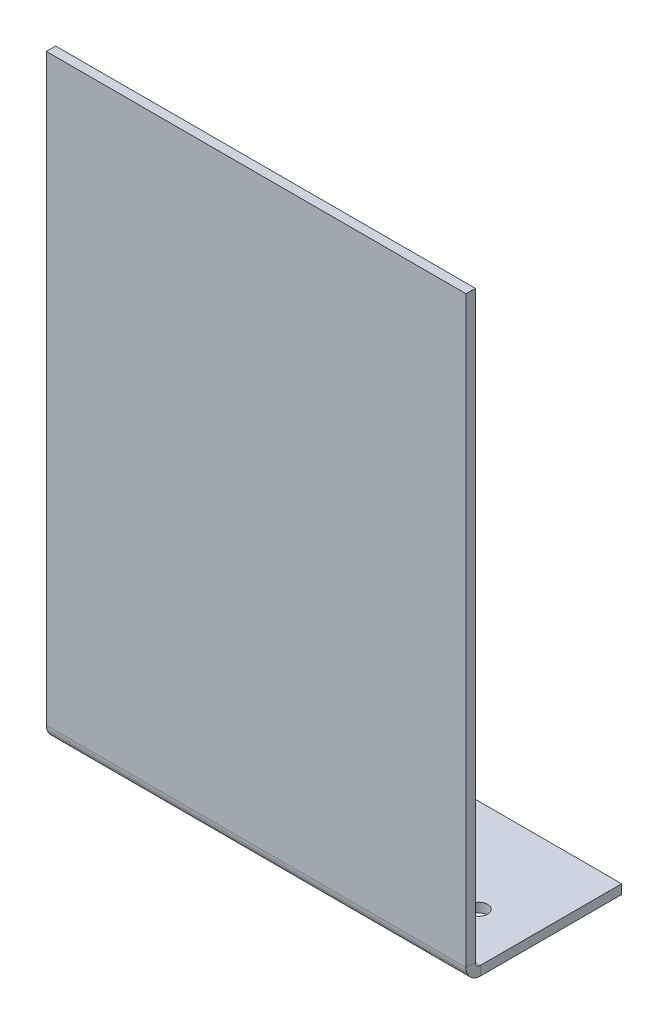
ISO-10303-21;
HEADER;
FILE_DESCRIPTION(('STEP AP214'),'2;1');
FILE_NAME('part.step','',(''),(''),'','','');
FILE_SCHEMA(('AUTOMOTIVE_DESIGN { 1 0 10303 214 1 1 1 1 }'));
ENDSEC;
DATA;
#1=APPLICATION_CONTEXT('core data for automotive mechanical design processes');
#2=APPLICATION_PROTOCOL_DEFINITION('international standard','automotive_design',2000,#1);
#3=PRODUCT_CONTEXT('',#1,'mechanical');
#4=PRODUCT('Part','Part','',(#3));
#5=PRODUCT_RELATED_PRODUCT_CATEGORY('part','',(#4));
#6=PRODUCT_DEFINITION_FORMATION('','',#4);
#7=PRODUCT_DEFINITION_CONTEXT('part definition',#1,'design');
#8=PRODUCT_DEFINITION('design','',#6,#7);
#9=PRODUCT_DEFINITION_SHAPE('','',#8);
#10=(LENGTH_UNIT() NAMED_UNIT(*) SI_UNIT(.MILLI.,.METRE.));
#11=(NAMED_UNIT(*) PLANE_ANGLE_UNIT() SI_UNIT($,.RADIAN.));
#12=(NAMED_UNIT(*) SI_UNIT($,.STERADIAN.) SOLID_ANGLE_UNIT());
#13=UNCERTAINTY_MEASURE_WITH_UNIT(LENGTH_MEASURE(1.E-05),#10,'distance_accuracy_value','');
#14=(GEOMETRIC_REPRESENTATION_CONTEXT(3) GLOBAL_UNCERTAINTY_ASSIGNED_CONTEXT((#13)) GLOBAL_UNIT_ASSIGNED_CONTEXT((#10,
#11,#12)) REPRESENTATION_CONTEXT('',''));
#15=CARTESIAN_POINT('',(0.,0.,0.));
#16=DIRECTION('',(0.,0.,1.));
#17=DIRECTION('',(1.,0.,0.));
#18=AXIS2_PLACEMENT_3D('',#15,#16,#17);
#19=CARTESIAN_POINT('',(0.,-25.7370725065091,26.6631274934909));
#20=DIRECTION('',(-1.,0.,0.));
#21=DIRECTION('',(0.,1.,0.));
#22=AXIS2_PLACEMENT_3D('',#19,#20,#21);
#23=PLANE('',#22);
#24=DIRECTION('',(0.,1.,0.));
#25=VECTOR('',#24,1.);
#26=CARTESIAN_POINT('',(0.,-25.7370725065091,25.0629274934909));
#27=LINE('',#26,#25);
#28=CARTESIAN_POINT('',(0.,0.889000000000004,25.0629274934909));
#29=VERTEX_POINT('',#28);
#30=CARTESIAN_POINT('',(0.,100.862927493491,25.0629274934905));
#31=VERTEX_POINT('',#30);
#32=EDGE_CURVE('E71',#29,#31,#27,.T.);
#33=ORIENTED_EDGE('',*,*,#32,.F.);
#34=DIRECTION('',(0.,0.,1.));
#35=VECTOR('',#34,1.);
#36=CARTESIAN_POINT('',(0.,0.889000000000011,26.6631274934909));
#37=LINE('',#36,#35);
#38=CARTESIAN_POINT('',(0.,0.889000000000011,26.6631274934909));
#39=VERTEX_POINT('',#38);
#40=EDGE_CURVE('E112',#29,#39,#37,.T.);
#41=ORIENTED_EDGE('',*,*,#40,.T.);
#42=DIRECTION('',(0.,1.,0.));
#43=VECTOR('',#42,1.);
#44=CARTESIAN_POINT('',(0.,-25.7370725065091,26.6631274934909));
#45=LINE('',#44,#43);
#46=CARTESIAN_POINT('',(0.,100.862927493491,26.6631274934905));
#47=VERTEX_POINT('',#46);
#48=EDGE_CURVE('E51',#39,#47,#45,.T.);
#49=ORIENTED_EDGE('',*,*,#48,.T.);
#50=DIRECTION('',(0.,0.,-1.));
#51=VECTOR('',#50,1.);
#52=CARTESIAN_POINT('',(0.,100.862927493491,26.6631274934905));
#53=LINE('',#52,#51);
#54=EDGE_CURVE('E197',#47,#31,#53,.T.);
#55=ORIENTED_EDGE('',*,*,#54,.T.);
#56=EDGE_LOOP('',(#33,#41,#49,#55));
#57=FACE_BOUND('',#56,.T.);
#58=ADVANCED_FACE('F47',(#57),#23,.T.);
#59=CARTESIAN_POINT('',(71.89414,-25.7370725065091,26.6631274934909));
#60=DIRECTION('',(1.,0.,0.));
#61=DIRECTION('',(0.,-1.,0.));
#62=AXIS2_PLACEMENT_3D('',#59,#60,#61);
#63=PLANE('',#62);
#64=DIRECTION('',(0.,-1.,0.));
#65=VECTOR('',#64,1.);
#66=CARTESIAN_POINT('',(71.89414,-25.7370725065091,26.6631274934909));
#67=LINE('',#66,#65);
#68=CARTESIAN_POINT('',(71.89414,100.862927493491,26.6631274934905));
#69=VERTEX_POINT('',#68);
#70=CARTESIAN_POINT('',(71.89414,0.889000000000015,26.6631274934908));
#71=VERTEX_POINT('',#70);
#72=EDGE_CURVE('E193',#69,#71,#67,.T.);
#73=ORIENTED_EDGE('',*,*,#72,.T.);
#74=DIRECTION('',(0.,0.,-1.));
#75=VECTOR('',#74,1.);
#76=CARTESIAN_POINT('',(71.89414,0.889000000000011,26.6631274934908));
#77=LINE('',#76,#75);
#78=CARTESIAN_POINT('',(71.89414,0.889000000000004,25.0629274934908));
#79=VERTEX_POINT('',#78);
#80=EDGE_CURVE('E12',#71,#79,#77,.T.);
#81=ORIENTED_EDGE('',*,*,#80,.T.);
#82=DIRECTION('',(0.,-1.,0.));
#83=VECTOR('',#82,1.);
#84=CARTESIAN_POINT('',(71.89414,-25.7370725065091,25.0629274934909));
#85=LINE('',#84,#83);
#86=CARTESIAN_POINT('',(71.89414,100.862927493491,25.0629274934905));
#87=VERTEX_POINT('',#86);
#88=EDGE_CURVE('E64',#87,#79,#85,.T.);
#89=ORIENTED_EDGE('',*,*,#88,.F.);
#90=DIRECTION('',(0.,0.,-1.));
#91=VECTOR('',#90,1.);
#92=CARTESIAN_POINT('',(71.89414,100.862927493491,26.6631274934905));
#93=LINE('',#92,#91);
#94=EDGE_CURVE('E137',#69,#87,#93,.T.);
#95=ORIENTED_EDGE('',*,*,#94,.F.);
#96=EDGE_LOOP('',(#73,#81,#89,#95));
#97=FACE_BOUND('',#96,.T.);
#98=ADVANCED_FACE('F49',(#97),#63,.T.);
#99=CARTESIAN_POINT('',(0.,-25.7370725065091,25.0629274934909));
#100=DIRECTION('',(0.,0.,-1.));
#101=DIRECTION('',(0.,1.,0.));
#102=AXIS2_PLACEMENT_3D('',#99,#100,#101);
#103=PLANE('',#102);
#104=ORIENTED_EDGE('',*,*,#88,.T.);
#105=DIRECTION('',(-1.,0.,0.));
#106=VECTOR('',#105,1.);
#107=CARTESIAN_POINT('',(0.,0.889000000000004,25.0629274934909));
#108=LINE('',#107,#106);
#109=EDGE_CURVE('E56',#79,#29,#108,.T.);
#110=ORIENTED_EDGE('',*,*,#109,.T.);
#111=ORIENTED_EDGE('',*,*,#32,.T.);
#112=DIRECTION('',(1.,0.,0.));
#113=VECTOR('',#112,1.);
#114=CARTESIAN_POINT('',(0.,100.862927493491,25.0629274934905));
#115=LINE('',#114,#113);
#116=EDGE_CURVE('E194',#31,#87,#115,.T.);
#117=ORIENTED_EDGE('',*,*,#116,.T.);
#118=EDGE_LOOP('',(#104,#110,#111,#117));
#119=FACE_BOUND('',#118,.T.);
#120=ADVANCED_FACE('F201',(#119),#103,.T.);
#121=CARTESIAN_POINT('',(0.,100.862927493491,26.6631274934905));
#122=DIRECTION('',(0.,1.,0.));
#123=DIRECTION('',(1.,0.,0.));
#124=AXIS2_PLACEMENT_3D('',#121,#122,#123);
#125=PLANE('',#124);
#126=ORIENTED_EDGE('',*,*,#116,.F.);
#127=ORIENTED_EDGE('',*,*,#54,.F.);
#128=DIRECTION('',(1.,0.,0.));
#129=VECTOR('',#128,1.);
#130=CARTESIAN_POINT('',(0.,100.862927493491,26.6631274934905));
#131=LINE('',#130,#129);
#132=EDGE_CURVE('E128',#47,#69,#131,.T.);
#133=ORIENTED_EDGE('',*,*,#132,.T.);
#134=ORIENTED_EDGE('',*,*,#94,.T.);
#135=EDGE_LOOP('',(#126,#127,#133,#134));
#136=FACE_BOUND('',#135,.T.);
#137=ADVANCED_FACE('F205',(#136),#125,.T.);
#138=CARTESIAN_POINT('',(0.,-25.7370725065091,26.6631274934909));
#139=DIRECTION('',(0.,0.,-1.));
#140=DIRECTION('',(0.,1.,0.));
#141=AXIS2_PLACEMENT_3D('',#138,#139,#140);
#142=PLANE('',#141);
#143=DIRECTION('',(-1.,0.,0.));
#144=VECTOR('',#143,1.);
#145=CARTESIAN_POINT('',(0.,0.889000000000011,26.6631274934909));
#146=LINE('',#145,#144);
#147=EDGE_CURVE('E119',#71,#39,#146,.T.);
#148=ORIENTED_EDGE('',*,*,#147,.F.);
#149=ORIENTED_EDGE('',*,*,#72,.F.);
#150=ORIENTED_EDGE('',*,*,#132,.F.);
#151=ORIENTED_EDGE('',*,*,#48,.F.);
#152=EDGE_LOOP('',(#148,#149,#150,#151));
#153=FACE_BOUND('',#152,.T.);
#154=ADVANCED_FACE('F124',(#153),#142,.F.);
#155=CARTESIAN_POINT('',(0.,-1.6002,0.));
#156=DIRECTION('',(0.,0.,-1.));
#157=DIRECTION('',(-1.,0.,0.));
#158=AXIS2_PLACEMENT_3D('',#155,#156,#157);
#159=PLANE('',#158);
#160=DIRECTION('',(-1.,0.,0.));
#161=VECTOR('',#160,1.);
#162=CARTESIAN_POINT('',(0.,0.,0.));
#163=LINE('',#162,#161);
#164=CARTESIAN_POINT('',(71.89414,0.,0.));
#165=VERTEX_POINT('',#164);
#166=CARTESIAN_POINT('',(0.,0.,0.));
#167=VERTEX_POINT('',#166);
#168=EDGE_CURVE('E162',#165,#167,#163,.T.);
#169=ORIENTED_EDGE('',*,*,#168,.F.);
#170=DIRECTION('',(0.,1.,0.));
#171=VECTOR('',#170,1.);
#172=CARTESIAN_POINT('',(71.89414,-1.6002,0.));
#173=LINE('',#172,#171);
#174=CARTESIAN_POINT('',(71.89414,-1.6002,0.));
#175=VERTEX_POINT('',#174);
#176=EDGE_CURVE('E155',#175,#165,#173,.T.);
#177=ORIENTED_EDGE('',*,*,#176,.F.);
#178=DIRECTION('',(-1.,0.,0.));
#179=VECTOR('',#178,1.);
#180=CARTESIAN_POINT('',(0.,-1.6002,0.));
#181=LINE('',#180,#179);
#182=CARTESIAN_POINT('',(0.,-1.6002,0.));
#183=VERTEX_POINT('',#182);
#184=EDGE_CURVE('E186',#175,#183,#181,.T.);
#185=ORIENTED_EDGE('',*,*,#184,.T.);
#186=DIRECTION('',(0.,1.,0.));
#187=VECTOR('',#186,1.);
#188=CARTESIAN_POINT('',(0.,-1.6002,0.));
#189=LINE('',#188,#187);
#190=EDGE_CURVE('E184',#183,#167,#189,.T.);
#191=ORIENTED_EDGE('',*,*,#190,.T.);
#192=EDGE_LOOP('',(#169,#177,#185,#191));
#193=FACE_BOUND('',#192,.T.);
#194=ADVANCED_FACE('F230',(#193),#159,.T.);
#195=CARTESIAN_POINT('',(8.44707,-1.6002,16.01));
#196=DIRECTION('',(0.,1.,0.));
#197=DIRECTION('',(0.,0.,1.));
#198=AXIS2_PLACEMENT_3D('',#195,#196,#197);
#199=CYLINDRICAL_SURFACE('',#198,1.4732);
#200=CARTESIAN_POINT('',(8.44707,-1.6002,16.01));
#201=DIRECTION('',(0.,1.,0.));
#202=DIRECTION('',(0.,0.,1.));
#203=AXIS2_PLACEMENT_3D('',#200,#201,#202);
#204=CIRCLE('',#203,1.4732);
#205=CARTESIAN_POINT('',(8.44707,-1.6002,17.4832));
#206=VERTEX_POINT('',#205);
#207=EDGE_CURVE('E172',#206,#206,#204,.T.);
#208=ORIENTED_EDGE('',*,*,#207,.F.);
#209=EDGE_LOOP('',(#208));
#210=FACE_BOUND('',#209,.T.);
#211=CARTESIAN_POINT('',(8.44707,0.,16.01));
#212=DIRECTION('',(0.,1.,0.));
#213=DIRECTION('',(0.,0.,1.));
#214=AXIS2_PLACEMENT_3D('',#211,#212,#213);
#215=CIRCLE('',#214,1.4732);
#216=CARTESIAN_POINT('',(8.44707,0.,17.4832));
#217=VERTEX_POINT('',#216);
#218=EDGE_CURVE('E181',#217,#217,#215,.T.);
#219=ORIENTED_EDGE('',*,*,#218,.T.);
#220=EDGE_LOOP('',(#219));
#221=FACE_BOUND('',#220,.T.);
#222=ADVANCED_FACE('F232',(#210,#221),#199,.F.);
#223=CARTESIAN_POINT('',(63.44707,-1.6002,16.01));
#224=DIRECTION('',(0.,1.,0.));
#225=DIRECTION('',(0.,0.,1.));
#226=AXIS2_PLACEMENT_3D('',#223,#224,#225);
#227=CYLINDRICAL_SURFACE('',#226,1.47320000000001);
#228=CARTESIAN_POINT('',(63.44707,-1.6002,16.01));
#229=DIRECTION('',(0.,1.,0.));
#230=DIRECTION('',(0.,0.,1.));
#231=AXIS2_PLACEMENT_3D('',#228,#229,#230);
#232=CIRCLE('',#231,1.47320000000001);
#233=CARTESIAN_POINT('',(63.44707,-1.6002,17.4832));
#234=VERTEX_POINT('',#233);
#235=EDGE_CURVE('E175',#234,#234,#232,.T.);
#236=ORIENTED_EDGE('',*,*,#235,.F.);
#237=EDGE_LOOP('',(#236));
#238=FACE_BOUND('',#237,.T.);
#239=CARTESIAN_POINT('',(63.44707,0.,16.01));
#240=DIRECTION('',(0.,1.,0.));
#241=DIRECTION('',(0.,0.,1.));
#242=AXIS2_PLACEMENT_3D('',#239,#240,#241);
#243=CIRCLE('',#242,1.47320000000001);
#244=CARTESIAN_POINT('',(63.44707,0.,17.4832));
#245=VERTEX_POINT('',#244);
#246=EDGE_CURVE('E178',#245,#245,#243,.T.);
#247=ORIENTED_EDGE('',*,*,#246,.T.);
#248=EDGE_LOOP('',(#247));
#249=FACE_BOUND('',#248,.T.);
#250=ADVANCED_FACE('F238',(#238,#249),#227,.F.);
#251=CARTESIAN_POINT('',(0.,-1.6002,0.));
#252=DIRECTION('',(0.,1.,0.));
#253=DIRECTION('',(0.,0.,1.));
#254=AXIS2_PLACEMENT_3D('',#251,#252,#253);
#255=PLANE('',#254);
#256=ORIENTED_EDGE('',*,*,#235,.T.);
#257=EDGE_LOOP('',(#256));
#258=FACE_BOUND('',#257,.T.);
#259=ORIENTED_EDGE('',*,*,#207,.T.);
#260=EDGE_LOOP('',(#259));
#261=FACE_BOUND('',#260,.T.);
#262=DIRECTION('',(0.,0.,-1.));
#263=VECTOR('',#262,1.);
#264=CARTESIAN_POINT('',(71.89414,-1.6002,0.));
#265=LINE('',#264,#263);
#266=CARTESIAN_POINT('',(71.89414,-1.6002,24.1739274934909));
#267=VERTEX_POINT('',#266);
#268=EDGE_CURVE('E158',#267,#175,#265,.T.);
#269=ORIENTED_EDGE('',*,*,#268,.F.);
#270=DIRECTION('',(-1.,0.,0.));
#271=VECTOR('',#270,1.);
#272=CARTESIAN_POINT('',(0.,-1.6002,24.1739274934909));
#273=LINE('',#272,#271);
#274=CARTESIAN_POINT('',(0.,-1.6002,24.1739274934909));
#275=VERTEX_POINT('',#274);
#276=EDGE_CURVE('E169',#267,#275,#273,.T.);
#277=ORIENTED_EDGE('',*,*,#276,.T.);
#278=DIRECTION('',(0.,0.,1.));
#279=VECTOR('',#278,1.);
#280=CARTESIAN_POINT('',(0.,-1.6002,0.));
#281=LINE('',#280,#279);
#282=EDGE_CURVE('E167',#183,#275,#281,.T.);
#283=ORIENTED_EDGE('',*,*,#282,.F.);
#284=ORIENTED_EDGE('',*,*,#184,.F.);
#285=EDGE_LOOP('',(#269,#277,#283,#284));
#286=FACE_BOUND('',#285,.T.);
#287=ADVANCED_FACE('F228',(#258,#261,#286),#255,.F.);
#288=CARTESIAN_POINT('',(0.,-1.6002,0.));
#289=DIRECTION('',(-1.,0.,0.));
#290=DIRECTION('',(0.,0.,1.));
#291=AXIS2_PLACEMENT_3D('',#288,#289,#290);
#292=PLANE('',#291);
#293=DIRECTION('',(0.,-1.,0.));
#294=VECTOR('',#293,1.);
#295=CARTESIAN_POINT('',(0.,-1.6002,24.1739274934909));
#296=LINE('',#295,#294);
#297=CARTESIAN_POINT('',(0.,0.,24.1739274934909));
#298=VERTEX_POINT('',#297);
#299=EDGE_CURVE('E142',#298,#275,#296,.T.);
#300=ORIENTED_EDGE('',*,*,#299,.F.);
#301=DIRECTION('',(0.,0.,1.));
#302=VECTOR('',#301,1.);
#303=CARTESIAN_POINT('',(0.,0.,0.));
#304=LINE('',#303,#302);
#305=EDGE_CURVE('E160',#167,#298,#304,.T.);
#306=ORIENTED_EDGE('',*,*,#305,.F.);
#307=ORIENTED_EDGE('',*,*,#190,.F.);
#308=ORIENTED_EDGE('',*,*,#282,.T.);
#309=EDGE_LOOP('',(#300,#306,#307,#308));
#310=FACE_BOUND('',#309,.T.);
#311=ADVANCED_FACE('F224',(#310),#292,.T.);
#312=CARTESIAN_POINT('',(0.,0.,0.));
#313=DIRECTION('',(0.,1.,0.));
#314=DIRECTION('',(0.,0.,1.));
#315=AXIS2_PLACEMENT_3D('',#312,#313,#314);
#316=PLANE('',#315);
#317=DIRECTION('',(-1.,0.,0.));
#318=VECTOR('',#317,1.);
#319=CARTESIAN_POINT('',(0.,0.,24.1739274934909));
#320=LINE('',#319,#318);
#321=CARTESIAN_POINT('',(71.89414,0.,24.1739274934909));
#322=VERTEX_POINT('',#321);
#323=EDGE_CURVE('E146',#322,#298,#320,.T.);
#324=ORIENTED_EDGE('',*,*,#323,.F.);
#325=DIRECTION('',(0.,0.,-1.));
#326=VECTOR('',#325,1.);
#327=CARTESIAN_POINT('',(71.89414,0.,0.));
#328=LINE('',#327,#326);
#329=EDGE_CURVE('E165',#322,#165,#328,.T.);
#330=ORIENTED_EDGE('',*,*,#329,.T.);
#331=ORIENTED_EDGE('',*,*,#168,.T.);
#332=ORIENTED_EDGE('',*,*,#305,.T.);
#333=EDGE_LOOP('',(#324,#330,#331,#332));
#334=FACE_BOUND('',#333,.T.);
#335=ORIENTED_EDGE('',*,*,#246,.F.);
#336=EDGE_LOOP('',(#335));
#337=FACE_BOUND('',#336,.T.);
#338=ORIENTED_EDGE('',*,*,#218,.F.);
#339=EDGE_LOOP('',(#338));
#340=FACE_BOUND('',#339,.T.);
#341=ADVANCED_FACE('F220',(#334,#337,#340),#316,.T.);
#342=CARTESIAN_POINT('',(71.89414,-1.6002,0.));
#343=DIRECTION('',(1.,0.,0.));
#344=DIRECTION('',(0.,0.,-1.));
#345=AXIS2_PLACEMENT_3D('',#342,#343,#344);
#346=PLANE('',#345);
#347=DIRECTION('',(0.,1.,0.));
#348=VECTOR('',#347,1.);
#349=CARTESIAN_POINT('',(71.89414,-1.6002,24.1739274934908));
#350=LINE('',#349,#348);
#351=EDGE_CURVE('E143',#267,#322,#350,.T.);
#352=ORIENTED_EDGE('',*,*,#351,.F.);
#353=ORIENTED_EDGE('',*,*,#268,.T.);
#354=ORIENTED_EDGE('',*,*,#176,.T.);
#355=ORIENTED_EDGE('',*,*,#329,.F.);
#356=EDGE_LOOP('',(#352,#353,#354,#355));
#357=FACE_BOUND('',#356,.T.);
#358=ADVANCED_FACE('F215',(#357),#346,.T.);
#359=CARTESIAN_POINT('',(71.89414,0.889,24.1739274934908));
#360=DIRECTION('',(1.,0.,0.));
#361=DIRECTION('',(0.,0.,-1.));
#362=AXIS2_PLACEMENT_3D('',#359,#360,#361);
#363=PLANE('',#362);
#364=ORIENTED_EDGE('',*,*,#351,.T.);
#365=CARTESIAN_POINT('',(71.89414,0.889,24.1739274934908));
#366=DIRECTION('',(-1.,0.,0.));
#367=DIRECTION('',(0.,0.,1.));
#368=AXIS2_PLACEMENT_3D('',#365,#366,#367);
#369=CIRCLE('',#368,0.889);
#370=EDGE_CURVE('E152',#322,#79,#369,.T.);
#371=ORIENTED_EDGE('',*,*,#370,.T.);
#372=ORIENTED_EDGE('',*,*,#80,.F.);
#373=CARTESIAN_POINT('',(71.89414,0.889,24.1739274934908));
#374=DIRECTION('',(-1.,0.,0.));
#375=DIRECTION('',(0.,0.,-1.));
#376=AXIS2_PLACEMENT_3D('',#373,#374,#375);
#377=CIRCLE('',#376,2.4892);
#378=EDGE_CURVE('E136',#267,#71,#377,.T.);
#379=ORIENTED_EDGE('',*,*,#378,.F.);
#380=EDGE_LOOP('',(#364,#371,#372,#379));
#381=FACE_BOUND('',#380,.T.);
#382=ADVANCED_FACE('F212',(#381),#363,.T.);
#383=CARTESIAN_POINT('',(0.,0.889,24.1739274934909));
#384=DIRECTION('',(-1.,0.,0.));
#385=DIRECTION('',(0.,0.,1.));
#386=AXIS2_PLACEMENT_3D('',#383,#384,#385);
#387=PLANE('',#386);
#388=ORIENTED_EDGE('',*,*,#40,.F.);
#389=CARTESIAN_POINT('',(0.,0.889,24.1739274934909));
#390=DIRECTION('',(-1.,0.,0.));
#391=DIRECTION('',(0.,0.,1.));
#392=AXIS2_PLACEMENT_3D('',#389,#390,#391);
#393=CIRCLE('',#392,0.889);
#394=EDGE_CURVE('E148',#29,#298,#393,.F.);
#395=ORIENTED_EDGE('',*,*,#394,.T.);
#396=ORIENTED_EDGE('',*,*,#299,.T.);
#397=CARTESIAN_POINT('',(0.,0.889,24.1739274934909));
#398=DIRECTION('',(1.,0.,0.));
#399=DIRECTION('',(0.,0.,1.));
#400=AXIS2_PLACEMENT_3D('',#397,#398,#399);
#401=CIRCLE('',#400,2.4892);
#402=EDGE_CURVE('E134',#39,#275,#401,.T.);
#403=ORIENTED_EDGE('',*,*,#402,.F.);
#404=EDGE_LOOP('',(#388,#395,#396,#403));
#405=FACE_BOUND('',#404,.T.);
#406=ADVANCED_FACE('F140',(#405),#387,.T.);
#407=CARTESIAN_POINT('',(107.900812234469,0.889,24.1739274934908));
#408=DIRECTION('',(-1.,0.,0.));
#409=DIRECTION('',(0.,0.,1.));
#410=AXIS2_PLACEMENT_3D('',#407,#408,#409);
#411=CYLINDRICAL_SURFACE('',#410,2.4892);
#412=ORIENTED_EDGE('',*,*,#402,.T.);
#413=ORIENTED_EDGE('',*,*,#276,.F.);
#414=ORIENTED_EDGE('',*,*,#378,.T.);
#415=ORIENTED_EDGE('',*,*,#147,.T.);
#416=EDGE_LOOP('',(#412,#413,#414,#415));
#417=FACE_BOUND('',#416,.T.);
#418=ADVANCED_FACE('F132',(#417),#411,.T.);
#419=CARTESIAN_POINT('',(107.900812234469,0.889,24.1739274934908));
#420=DIRECTION('',(-1.,0.,0.));
#421=DIRECTION('',(0.,0.,1.));
#422=AXIS2_PLACEMENT_3D('',#419,#420,#421);
#423=CYLINDRICAL_SURFACE('',#422,0.889);
#424=ORIENTED_EDGE('',*,*,#394,.F.);
#425=ORIENTED_EDGE('',*,*,#109,.F.);
#426=ORIENTED_EDGE('',*,*,#370,.F.);
#427=ORIENTED_EDGE('',*,*,#323,.T.);
#428=EDGE_LOOP('',(#424,#425,#426,#427));
#429=FACE_BOUND('',#428,.T.);
#430=ADVANCED_FACE('F211',(#429),#423,.F.);
#431=CLOSED_SHELL('',(#58,#98,#120,#137,#154,#194,#222,#250,#287,#311,#341,#358,#382,#406,#418,#430));
#432=MANIFOLD_SOLID_BREP('B2',#431);
#433=ADVANCED_BREP_SHAPE_REPRESENTATION('',(#18,#432),#14);
#434=SHAPE_DEFINITION_REPRESENTATION(#9,#433);
ENDSEC;
END-ISO-10303-21;
